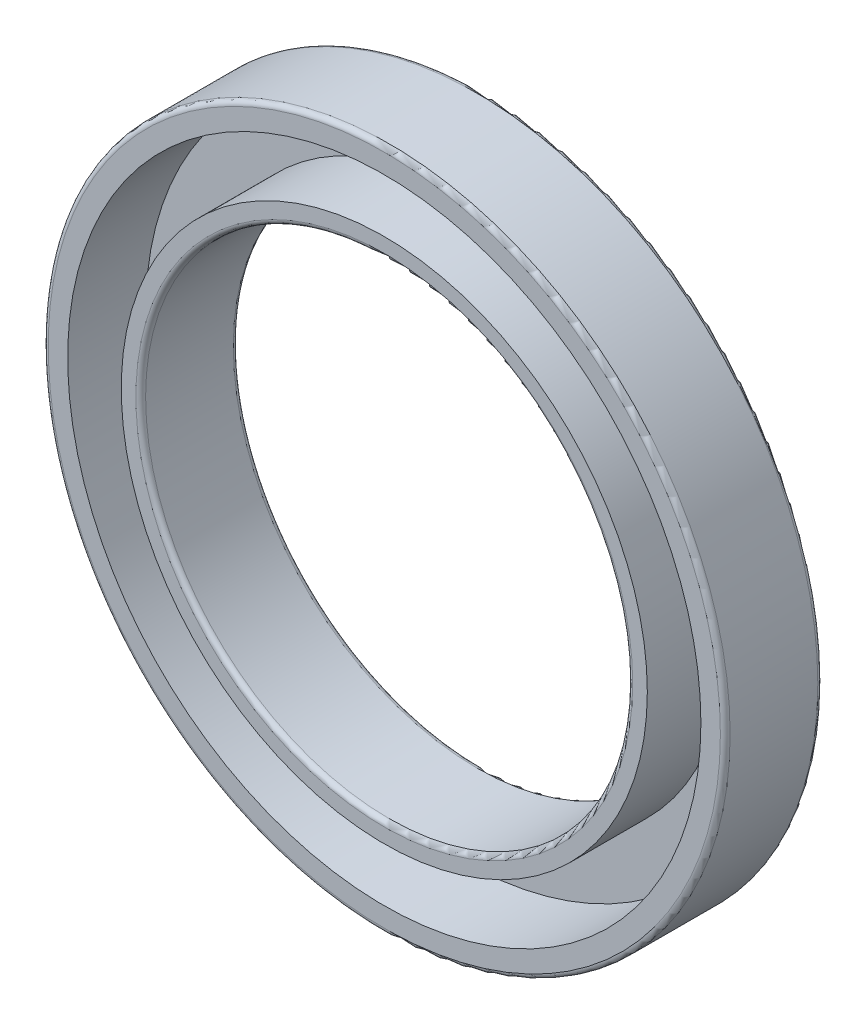
ISO-10303-21;
HEADER;
FILE_DESCRIPTION(('STEP AP214'),'2;1');
FILE_NAME('part.step','',(''),(''),'','','');
FILE_SCHEMA(('AUTOMOTIVE_DESIGN { 1 0 10303 214 1 1 1 1 }'));
ENDSEC;
DATA;
#1=APPLICATION_CONTEXT('core data for automotive mechanical design processes');
#2=APPLICATION_PROTOCOL_DEFINITION('international standard','automotive_design',2000,#1);
#3=PRODUCT_CONTEXT('',#1,'mechanical');
#4=PRODUCT('Part','Part','',(#3));
#5=PRODUCT_RELATED_PRODUCT_CATEGORY('part','',(#4));
#6=PRODUCT_DEFINITION_FORMATION('','',#4);
#7=PRODUCT_DEFINITION_CONTEXT('part definition',#1,'design');
#8=PRODUCT_DEFINITION('design','',#6,#7);
#9=PRODUCT_DEFINITION_SHAPE('','',#8);
#10=(LENGTH_UNIT() NAMED_UNIT(*) SI_UNIT(.MILLI.,.METRE.));
#11=(NAMED_UNIT(*) PLANE_ANGLE_UNIT() SI_UNIT($,.RADIAN.));
#12=(NAMED_UNIT(*) SI_UNIT($,.STERADIAN.) SOLID_ANGLE_UNIT());
#13=UNCERTAINTY_MEASURE_WITH_UNIT(LENGTH_MEASURE(1.E-05),#10,'distance_accuracy_value','');
#14=(GEOMETRIC_REPRESENTATION_CONTEXT(3) GLOBAL_UNCERTAINTY_ASSIGNED_CONTEXT((#13)) GLOBAL_UNIT_ASSIGNED_CONTEXT((#10,
#11,#12)) REPRESENTATION_CONTEXT('',''));
#15=CARTESIAN_POINT('',(0.,0.,0.));
#16=DIRECTION('',(0.,0.,1.));
#17=DIRECTION('',(1.,0.,0.));
#18=AXIS2_PLACEMENT_3D('',#15,#16,#17);
#19=CARTESIAN_POINT('',(0.,0.,10.));
#20=DIRECTION('',(0.,0.,1.));
#21=DIRECTION('',(1.,0.,0.));
#22=AXIS2_PLACEMENT_3D('',#19,#20,#21);
#23=PLANE('',#22);
#24=CARTESIAN_POINT('',(0.,0.,10.));
#25=DIRECTION('',(0.,0.,1.));
#26=DIRECTION('',(1.,0.,0.));
#27=AXIS2_PLACEMENT_3D('',#24,#25,#26);
#28=CIRCLE('',#27,25.5);
#29=CARTESIAN_POINT('',(25.5,0.,10.));
#30=VERTEX_POINT('',#29);
#31=EDGE_CURVE('E54',#30,#30,#28,.F.);
#32=ORIENTED_EDGE('',*,*,#31,.T.);
#33=EDGE_LOOP('',(#32));
#34=FACE_BOUND('',#33,.T.);
#35=CARTESIAN_POINT('',(0.,0.,10.));
#36=DIRECTION('',(0.,0.,1.));
#37=DIRECTION('',(1.,0.,0.));
#38=AXIS2_PLACEMENT_3D('',#35,#36,#37);
#39=CIRCLE('',#38,27.);
#40=CARTESIAN_POINT('',(27.,0.,10.));
#41=VERTEX_POINT('',#40);
#42=EDGE_CURVE('E85',#41,#41,#39,.T.);
#43=ORIENTED_EDGE('',*,*,#42,.T.);
#44=EDGE_LOOP('',(#43));
#45=FACE_BOUND('',#44,.T.);
#46=ADVANCED_FACE('F36',(#34,#45),#23,.T.);
#47=CARTESIAN_POINT('',(0.,0.,10.));
#48=DIRECTION('',(0.,0.,1.));
#49=DIRECTION('',(1.,0.,0.));
#50=AXIS2_PLACEMENT_3D('',#47,#48,#49);
#51=CIRCLE('',#50,34.5);
#52=CARTESIAN_POINT('',(34.5,0.,10.));
#53=VERTEX_POINT('',#52);
#54=EDGE_CURVE('E49',#53,#53,#51,.T.);
#55=ORIENTED_EDGE('',*,*,#54,.T.);
#56=EDGE_LOOP('',(#55));
#57=FACE_BOUND('',#56,.T.);
#58=CARTESIAN_POINT('',(0.,0.,10.));
#59=DIRECTION('',(0.,0.,1.));
#60=DIRECTION('',(1.,0.,0.));
#61=AXIS2_PLACEMENT_3D('',#58,#59,#60);
#62=CIRCLE('',#61,32.5);
#63=CARTESIAN_POINT('',(32.5,0.,10.));
#64=VERTEX_POINT('',#63);
#65=EDGE_CURVE('E77',#64,#64,#62,.T.);
#66=ORIENTED_EDGE('',*,*,#65,.F.);
#67=EDGE_LOOP('',(#66));
#68=FACE_BOUND('',#67,.T.);
#69=ADVANCED_FACE('F109',(#57,#68),#23,.T.);
#70=CARTESIAN_POINT('',(0.,0.,0.));
#71=DIRECTION('',(0.,0.,1.));
#72=DIRECTION('',(1.,0.,0.));
#73=AXIS2_PLACEMENT_3D('',#70,#71,#72);
#74=PLANE('',#73);
#75=CARTESIAN_POINT('',(0.,0.,0.));
#76=DIRECTION('',(0.,0.,1.));
#77=DIRECTION('',(1.,0.,0.));
#78=AXIS2_PLACEMENT_3D('',#75,#76,#77);
#79=CIRCLE('',#78,25.5);
#80=CARTESIAN_POINT('',(25.5,0.,0.));
#81=VERTEX_POINT('',#80);
#82=EDGE_CURVE('E68',#81,#81,#79,.T.);
#83=ORIENTED_EDGE('',*,*,#82,.T.);
#84=EDGE_LOOP('',(#83));
#85=FACE_BOUND('',#84,.T.);
#86=CARTESIAN_POINT('',(0.,0.,0.));
#87=DIRECTION('',(0.,0.,1.));
#88=DIRECTION('',(1.,0.,0.));
#89=AXIS2_PLACEMENT_3D('',#86,#87,#88);
#90=CIRCLE('',#89,34.5);
#91=CARTESIAN_POINT('',(34.5,0.,0.));
#92=VERTEX_POINT('',#91);
#93=EDGE_CURVE('E72',#92,#92,#90,.F.);
#94=ORIENTED_EDGE('',*,*,#93,.T.);
#95=EDGE_LOOP('',(#94));
#96=FACE_BOUND('',#95,.T.);
#97=ADVANCED_FACE('F111',(#85,#96),#74,.F.);
#98=CARTESIAN_POINT('',(0.,0.,10.));
#99=DIRECTION('',(0.,0.,-1.));
#100=DIRECTION('',(-1.,0.,0.));
#101=AXIS2_PLACEMENT_3D('',#98,#99,#100);
#102=CYLINDRICAL_SURFACE('',#101,35.);
#103=CARTESIAN_POINT('',(0.,0.,9.5));
#104=DIRECTION('',(0.,0.,1.));
#105=DIRECTION('',(1.,0.,0.));
#106=AXIS2_PLACEMENT_3D('',#103,#104,#105);
#107=CIRCLE('',#106,35.);
#108=CARTESIAN_POINT('',(35.,0.,9.5));
#109=VERTEX_POINT('',#108);
#110=EDGE_CURVE('E10',#109,#109,#107,.F.);
#111=ORIENTED_EDGE('',*,*,#110,.T.);
#112=EDGE_LOOP('',(#111));
#113=FACE_BOUND('',#112,.T.);
#114=CARTESIAN_POINT('',(0.,0.,0.5));
#115=DIRECTION('',(0.,0.,1.));
#116=DIRECTION('',(1.,0.,0.));
#117=AXIS2_PLACEMENT_3D('',#114,#115,#116);
#118=CIRCLE('',#117,35.);
#119=CARTESIAN_POINT('',(35.,0.,0.5));
#120=VERTEX_POINT('',#119);
#121=EDGE_CURVE('E44',#120,#120,#118,.T.);
#122=ORIENTED_EDGE('',*,*,#121,.T.);
#123=EDGE_LOOP('',(#122));
#124=FACE_BOUND('',#123,.T.);
#125=ADVANCED_FACE('F118',(#113,#124),#102,.T.);
#126=CARTESIAN_POINT('',(0.,0.,10.));
#127=DIRECTION('',(0.,0.,-1.));
#128=DIRECTION('',(-1.,0.,0.));
#129=AXIS2_PLACEMENT_3D('',#126,#127,#128);
#130=CYLINDRICAL_SURFACE('',#129,25.);
#131=CARTESIAN_POINT('',(0.,0.,0.5));
#132=DIRECTION('',(0.,0.,1.));
#133=DIRECTION('',(1.,0.,0.));
#134=AXIS2_PLACEMENT_3D('',#131,#132,#133);
#135=CIRCLE('',#134,25.);
#136=CARTESIAN_POINT('',(25.,0.,0.5));
#137=VERTEX_POINT('',#136);
#138=EDGE_CURVE('E60',#137,#137,#135,.F.);
#139=ORIENTED_EDGE('',*,*,#138,.T.);
#140=EDGE_LOOP('',(#139));
#141=FACE_BOUND('',#140,.T.);
#142=CARTESIAN_POINT('',(0.,0.,9.5));
#143=DIRECTION('',(0.,0.,1.));
#144=DIRECTION('',(1.,0.,0.));
#145=AXIS2_PLACEMENT_3D('',#142,#143,#144);
#146=CIRCLE('',#145,25.);
#147=CARTESIAN_POINT('',(25.,0.,9.5));
#148=VERTEX_POINT('',#147);
#149=EDGE_CURVE('E64',#148,#148,#146,.T.);
#150=ORIENTED_EDGE('',*,*,#149,.T.);
#151=EDGE_LOOP('',(#150));
#152=FACE_BOUND('',#151,.T.);
#153=ADVANCED_FACE('F105',(#141,#152),#130,.F.);
#154=CARTESIAN_POINT('',(0.,0.,2.));
#155=DIRECTION('',(0.,0.,1.));
#156=DIRECTION('',(1.,0.,0.));
#157=AXIS2_PLACEMENT_3D('',#154,#155,#156);
#158=CYLINDRICAL_SURFACE('',#157,32.5);
#159=CARTESIAN_POINT('',(0.,0.,2.));
#160=DIRECTION('',(0.,0.,1.));
#161=DIRECTION('',(1.,0.,0.));
#162=AXIS2_PLACEMENT_3D('',#159,#160,#161);
#163=CIRCLE('',#162,32.5);
#164=CARTESIAN_POINT('',(32.5,0.,2.));
#165=VERTEX_POINT('',#164);
#166=EDGE_CURVE('E76',#165,#165,#163,.T.);
#167=ORIENTED_EDGE('',*,*,#166,.F.);
#168=EDGE_LOOP('',(#167));
#169=FACE_BOUND('',#168,.T.);
#170=ORIENTED_EDGE('',*,*,#65,.T.);
#171=EDGE_LOOP('',(#170));
#172=FACE_BOUND('',#171,.T.);
#173=ADVANCED_FACE('F99',(#169,#172),#158,.F.);
#174=CARTESIAN_POINT('',(0.,0.,2.));
#175=DIRECTION('',(0.,0.,1.));
#176=DIRECTION('',(1.,0.,0.));
#177=AXIS2_PLACEMENT_3D('',#174,#175,#176);
#178=PLANE('',#177);
#179=CARTESIAN_POINT('',(0.,0.,2.));
#180=DIRECTION('',(0.,0.,1.));
#181=DIRECTION('',(1.,0.,0.));
#182=AXIS2_PLACEMENT_3D('',#179,#180,#181);
#183=CIRCLE('',#182,27.);
#184=CARTESIAN_POINT('',(27.,0.,2.));
#185=VERTEX_POINT('',#184);
#186=EDGE_CURVE('E81',#185,#185,#183,.T.);
#187=ORIENTED_EDGE('',*,*,#186,.F.);
#188=EDGE_LOOP('',(#187));
#189=FACE_BOUND('',#188,.T.);
#190=ORIENTED_EDGE('',*,*,#166,.T.);
#191=EDGE_LOOP('',(#190));
#192=FACE_BOUND('',#191,.T.);
#193=ADVANCED_FACE('F96',(#189,#192),#178,.T.);
#194=CARTESIAN_POINT('',(0.,0.,2.));
#195=DIRECTION('',(0.,0.,1.));
#196=DIRECTION('',(1.,0.,0.));
#197=AXIS2_PLACEMENT_3D('',#194,#195,#196);
#198=CYLINDRICAL_SURFACE('',#197,27.);
#199=ORIENTED_EDGE('',*,*,#186,.T.);
#200=EDGE_LOOP('',(#199));
#201=FACE_BOUND('',#200,.T.);
#202=ORIENTED_EDGE('',*,*,#42,.F.);
#203=EDGE_LOOP('',(#202));
#204=FACE_BOUND('',#203,.T.);
#205=ADVANCED_FACE('F93',(#201,#204),#198,.T.);
#206=CARTESIAN_POINT('',(0.,0.,0.5));
#207=DIRECTION('',(0.,0.,1.));
#208=DIRECTION('',(1.,0.,0.));
#209=AXIS2_PLACEMENT_3D('',#206,#207,#208);
#210=TOROIDAL_SURFACE('',#209,25.5,0.5);
#211=ORIENTED_EDGE('',*,*,#138,.F.);
#212=EDGE_LOOP('',(#211));
#213=FACE_BOUND('',#212,.T.);
#214=ORIENTED_EDGE('',*,*,#82,.F.);
#215=EDGE_LOOP('',(#214));
#216=FACE_BOUND('',#215,.T.);
#217=ADVANCED_FACE('F126',(#213,#216),#210,.T.);
#218=CARTESIAN_POINT('',(0.,0.,9.5));
#219=DIRECTION('',(0.,0.,1.));
#220=DIRECTION('',(1.,0.,0.));
#221=AXIS2_PLACEMENT_3D('',#218,#219,#220);
#222=TOROIDAL_SURFACE('',#221,25.5,0.5);
#223=ORIENTED_EDGE('',*,*,#31,.F.);
#224=EDGE_LOOP('',(#223));
#225=FACE_BOUND('',#224,.T.);
#226=ORIENTED_EDGE('',*,*,#149,.F.);
#227=EDGE_LOOP('',(#226));
#228=FACE_BOUND('',#227,.T.);
#229=ADVANCED_FACE('F129',(#225,#228),#222,.T.);
#230=CARTESIAN_POINT('',(0.,0.,9.5));
#231=DIRECTION('',(0.,0.,1.));
#232=DIRECTION('',(1.,0.,0.));
#233=AXIS2_PLACEMENT_3D('',#230,#231,#232);
#234=TOROIDAL_SURFACE('',#233,34.5,0.5);
#235=ORIENTED_EDGE('',*,*,#110,.F.);
#236=EDGE_LOOP('',(#235));
#237=FACE_BOUND('',#236,.T.);
#238=ORIENTED_EDGE('',*,*,#54,.F.);
#239=EDGE_LOOP('',(#238));
#240=FACE_BOUND('',#239,.T.);
#241=ADVANCED_FACE('F132',(#237,#240),#234,.T.);
#242=CARTESIAN_POINT('',(0.,0.,0.5));
#243=DIRECTION('',(0.,0.,1.));
#244=DIRECTION('',(1.,0.,0.));
#245=AXIS2_PLACEMENT_3D('',#242,#243,#244);
#246=TOROIDAL_SURFACE('',#245,34.5,0.5);
#247=ORIENTED_EDGE('',*,*,#93,.F.);
#248=EDGE_LOOP('',(#247));
#249=FACE_BOUND('',#248,.T.);
#250=ORIENTED_EDGE('',*,*,#121,.F.);
#251=EDGE_LOOP('',(#250));
#252=FACE_BOUND('',#251,.T.);
#253=ADVANCED_FACE('F38',(#249,#252),#246,.T.);
#254=CLOSED_SHELL('',(#46,#69,#97,#125,#153,#173,#193,#205,#217,#229,#241,#253));
#255=MANIFOLD_SOLID_BREP('B2',#254);
#256=ADVANCED_BREP_SHAPE_REPRESENTATION('',(#18,#255),#14);
#257=SHAPE_DEFINITION_REPRESENTATION(#9,#256);
ENDSEC;
END-ISO-10303-21;
